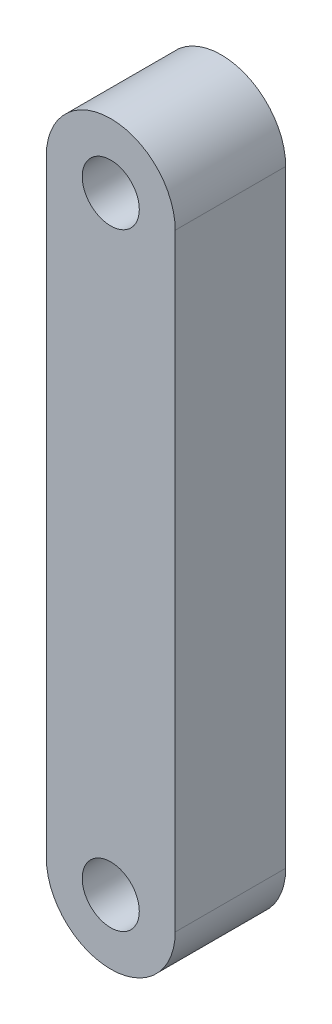
ISO-10303-21;
HEADER;
FILE_DESCRIPTION(('STEP AP214'),'2;1');
FILE_NAME('part.step','',(''),(''),'','','');
FILE_SCHEMA(('AUTOMOTIVE_DESIGN { 1 0 10303 214 1 1 1 1 }'));
ENDSEC;
DATA;
#1=APPLICATION_CONTEXT('core data for automotive mechanical design processes');
#2=APPLICATION_PROTOCOL_DEFINITION('international standard','automotive_design',2000,#1);
#3=PRODUCT_CONTEXT('',#1,'mechanical');
#4=PRODUCT('Part','Part','',(#3));
#5=PRODUCT_RELATED_PRODUCT_CATEGORY('part','',(#4));
#6=PRODUCT_DEFINITION_FORMATION('','',#4);
#7=PRODUCT_DEFINITION_CONTEXT('part definition',#1,'design');
#8=PRODUCT_DEFINITION('design','',#6,#7);
#9=PRODUCT_DEFINITION_SHAPE('','',#8);
#10=(LENGTH_UNIT() NAMED_UNIT(*) SI_UNIT(.MILLI.,.METRE.));
#11=(NAMED_UNIT(*) PLANE_ANGLE_UNIT() SI_UNIT($,.RADIAN.));
#12=(NAMED_UNIT(*) SI_UNIT($,.STERADIAN.) SOLID_ANGLE_UNIT());
#13=UNCERTAINTY_MEASURE_WITH_UNIT(LENGTH_MEASURE(1.E-05),#10,'distance_accuracy_value','');
#14=(GEOMETRIC_REPRESENTATION_CONTEXT(3) GLOBAL_UNCERTAINTY_ASSIGNED_CONTEXT((#13)) GLOBAL_UNIT_ASSIGNED_CONTEXT((#10,
#11,#12)) REPRESENTATION_CONTEXT('',''));
#15=CARTESIAN_POINT('',(0.,0.,0.));
#16=DIRECTION('',(0.,0.,1.));
#17=DIRECTION('',(1.,0.,0.));
#18=AXIS2_PLACEMENT_3D('',#15,#16,#17);
#19=CARTESIAN_POINT('',(1141.44953163294,-4.21114111849392,6.));
#20=DIRECTION('',(0.,0.,1.));
#21=DIRECTION('',(1.,0.,0.));
#22=AXIS2_PLACEMENT_3D('',#19,#20,#21);
#23=PLANE('',#22);
#24=CARTESIAN_POINT('',(1141.44953163294,-4.21114111849392,6.));
#25=DIRECTION('',(0.,0.,1.));
#26=DIRECTION('',(1.,0.,0.));
#27=AXIS2_PLACEMENT_3D('',#24,#25,#26);
#28=CIRCLE('',#27,1.54999999999999);
#29=CARTESIAN_POINT('',(1142.99953163294,-4.21114111849392,6.));
#30=VERTEX_POINT('',#29);
#31=EDGE_CURVE('E101',#30,#30,#28,.T.);
#32=ORIENTED_EDGE('',*,*,#31,.F.);
#33=EDGE_LOOP('',(#32));
#34=FACE_BOUND('',#33,.T.);
#35=CARTESIAN_POINT('',(1141.44953163294,-4.21114111849392,6.));
#36=DIRECTION('',(0.,0.,1.));
#37=DIRECTION('',(1.,0.,0.));
#38=AXIS2_PLACEMENT_3D('',#35,#36,#37);
#39=CIRCLE('',#38,3.50000000000006);
#40=CARTESIAN_POINT('',(1144.94953163294,-4.21114111849392,6.));
#41=VERTEX_POINT('',#40);
#42=CARTESIAN_POINT('',(1137.94953163294,-4.21114111849394,6.));
#43=VERTEX_POINT('',#42);
#44=EDGE_CURVE('E86',#41,#43,#39,.T.);
#45=ORIENTED_EDGE('',*,*,#44,.T.);
#46=DIRECTION('',(0.,-1.,0.));
#47=VECTOR('',#46,1.);
#48=CARTESIAN_POINT('',(1137.94953163294,-4.21114111849394,6.));
#49=LINE('',#48,#47);
#50=CARTESIAN_POINT('',(1137.94953163294,-37.2111411184939,6.));
#51=VERTEX_POINT('',#50);
#52=EDGE_CURVE('E81',#43,#51,#49,.T.);
#53=ORIENTED_EDGE('',*,*,#52,.T.);
#54=CARTESIAN_POINT('',(1141.44953163294,-37.2111411184939,6.));
#55=DIRECTION('',(0.,0.,1.));
#56=DIRECTION('',(1.,0.,0.));
#57=AXIS2_PLACEMENT_3D('',#54,#55,#56);
#58=CIRCLE('',#57,3.50000000000006);
#59=CARTESIAN_POINT('',(1144.94953163294,-37.2111411184939,6.));
#60=VERTEX_POINT('',#59);
#61=EDGE_CURVE('E84',#51,#60,#58,.T.);
#62=ORIENTED_EDGE('',*,*,#61,.T.);
#63=DIRECTION('',(0.,1.,0.));
#64=VECTOR('',#63,1.);
#65=CARTESIAN_POINT('',(1144.94953163294,-37.2111411184939,6.));
#66=LINE('',#65,#64);
#67=EDGE_CURVE('E51',#60,#41,#66,.T.);
#68=ORIENTED_EDGE('',*,*,#67,.T.);
#69=EDGE_LOOP('',(#45,#53,#62,#68));
#70=FACE_BOUND('',#69,.T.);
#71=CARTESIAN_POINT('',(1141.44953163294,-37.2111411184939,6.));
#72=DIRECTION('',(0.,0.,1.));
#73=DIRECTION('',(1.,0.,0.));
#74=AXIS2_PLACEMENT_3D('',#71,#72,#73);
#75=CIRCLE('',#74,1.54999999999999);
#76=CARTESIAN_POINT('',(1142.99953163294,-37.2111411184939,6.));
#77=VERTEX_POINT('',#76);
#78=EDGE_CURVE('E116',#77,#77,#75,.T.);
#79=ORIENTED_EDGE('',*,*,#78,.F.);
#80=EDGE_LOOP('',(#79));
#81=FACE_BOUND('',#80,.T.);
#82=ADVANCED_FACE('F34',(#34,#70,#81),#23,.T.);
#83=CARTESIAN_POINT('',(1141.44953163294,-4.21114111849392,0.));
#84=DIRECTION('',(0.,0.,1.));
#85=DIRECTION('',(1.,0.,0.));
#86=AXIS2_PLACEMENT_3D('',#83,#84,#85);
#87=PLANE('',#86);
#88=CARTESIAN_POINT('',(1141.44953163294,-4.21114111849392,0.));
#89=DIRECTION('',(0.,0.,1.));
#90=DIRECTION('',(1.,0.,0.));
#91=AXIS2_PLACEMENT_3D('',#88,#89,#90);
#92=CIRCLE('',#91,1.54999999999999);
#93=CARTESIAN_POINT('',(1142.99953163294,-4.21114111849392,0.));
#94=VERTEX_POINT('',#93);
#95=EDGE_CURVE('E113',#94,#94,#92,.T.);
#96=ORIENTED_EDGE('',*,*,#95,.T.);
#97=EDGE_LOOP('',(#96));
#98=FACE_BOUND('',#97,.T.);
#99=CARTESIAN_POINT('',(1141.44953163294,-4.21114111849392,0.));
#100=DIRECTION('',(0.,0.,1.));
#101=DIRECTION('',(1.,0.,0.));
#102=AXIS2_PLACEMENT_3D('',#99,#100,#101);
#103=CIRCLE('',#102,3.50000000000006);
#104=CARTESIAN_POINT('',(1144.94953163294,-4.21114111849392,0.));
#105=VERTEX_POINT('',#104);
#106=CARTESIAN_POINT('',(1137.94953163294,-4.21114111849394,0.));
#107=VERTEX_POINT('',#106);
#108=EDGE_CURVE('E98',#105,#107,#103,.T.);
#109=ORIENTED_EDGE('',*,*,#108,.F.);
#110=DIRECTION('',(0.,1.,0.));
#111=VECTOR('',#110,1.);
#112=CARTESIAN_POINT('',(1144.94953163294,-37.2111411184939,0.));
#113=LINE('',#112,#111);
#114=CARTESIAN_POINT('',(1144.94953163294,-37.2111411184939,0.));
#115=VERTEX_POINT('',#114);
#116=EDGE_CURVE('E74',#115,#105,#113,.T.);
#117=ORIENTED_EDGE('',*,*,#116,.F.);
#118=CARTESIAN_POINT('',(1141.44953163294,-37.2111411184939,0.));
#119=DIRECTION('',(0.,0.,1.));
#120=DIRECTION('',(1.,0.,0.));
#121=AXIS2_PLACEMENT_3D('',#118,#119,#120);
#122=CIRCLE('',#121,3.50000000000006);
#123=CARTESIAN_POINT('',(1137.94953163294,-37.2111411184939,0.));
#124=VERTEX_POINT('',#123);
#125=EDGE_CURVE('E68',#124,#115,#122,.T.);
#126=ORIENTED_EDGE('',*,*,#125,.F.);
#127=DIRECTION('',(0.,-1.,0.));
#128=VECTOR('',#127,1.);
#129=CARTESIAN_POINT('',(1137.94953163294,-4.21114111849394,0.));
#130=LINE('',#129,#128);
#131=EDGE_CURVE('E90',#107,#124,#130,.T.);
#132=ORIENTED_EDGE('',*,*,#131,.F.);
#133=EDGE_LOOP('',(#109,#117,#126,#132));
#134=FACE_BOUND('',#133,.T.);
#135=CARTESIAN_POINT('',(1141.44953163294,-37.2111411184939,0.));
#136=DIRECTION('',(0.,0.,1.));
#137=DIRECTION('',(1.,0.,0.));
#138=AXIS2_PLACEMENT_3D('',#135,#136,#137);
#139=CIRCLE('',#138,1.54999999999999);
#140=CARTESIAN_POINT('',(1142.99953163294,-37.2111411184939,0.));
#141=VERTEX_POINT('',#140);
#142=EDGE_CURVE('E119',#141,#141,#139,.T.);
#143=ORIENTED_EDGE('',*,*,#142,.T.);
#144=EDGE_LOOP('',(#143));
#145=FACE_BOUND('',#144,.T.);
#146=ADVANCED_FACE('F109',(#98,#134,#145),#87,.F.);
#147=CARTESIAN_POINT('',(1141.44953163294,-4.21114111849392,6.));
#148=DIRECTION('',(0.,0.,-1.));
#149=DIRECTION('',(-1.,0.,0.));
#150=AXIS2_PLACEMENT_3D('',#147,#148,#149);
#151=CYLINDRICAL_SURFACE('',#150,3.50000000000006);
#152=ORIENTED_EDGE('',*,*,#108,.T.);
#153=DIRECTION('',(0.,0.,-1.));
#154=VECTOR('',#153,1.);
#155=CARTESIAN_POINT('',(1137.94953163294,-4.21114111849394,6.));
#156=LINE('',#155,#154);
#157=EDGE_CURVE('E11',#43,#107,#156,.T.);
#158=ORIENTED_EDGE('',*,*,#157,.F.);
#159=ORIENTED_EDGE('',*,*,#44,.F.);
#160=DIRECTION('',(0.,0.,-1.));
#161=VECTOR('',#160,1.);
#162=CARTESIAN_POINT('',(1144.94953163294,-4.21114111849392,6.));
#163=LINE('',#162,#161);
#164=EDGE_CURVE('E94',#41,#105,#163,.T.);
#165=ORIENTED_EDGE('',*,*,#164,.T.);
#166=EDGE_LOOP('',(#152,#158,#159,#165));
#167=FACE_BOUND('',#166,.T.);
#168=ADVANCED_FACE('F36',(#167),#151,.T.);
#169=CARTESIAN_POINT('',(1137.94953163294,-4.21114111849394,6.));
#170=DIRECTION('',(1.,0.,0.));
#171=DIRECTION('',(0.,0.,-1.));
#172=AXIS2_PLACEMENT_3D('',#169,#170,#171);
#173=PLANE('',#172);
#174=ORIENTED_EDGE('',*,*,#131,.T.);
#175=DIRECTION('',(0.,0.,-1.));
#176=VECTOR('',#175,1.);
#177=CARTESIAN_POINT('',(1137.94953163294,-37.2111411184939,6.));
#178=LINE('',#177,#176);
#179=EDGE_CURVE('E43',#51,#124,#178,.T.);
#180=ORIENTED_EDGE('',*,*,#179,.F.);
#181=ORIENTED_EDGE('',*,*,#52,.F.);
#182=ORIENTED_EDGE('',*,*,#157,.T.);
#183=EDGE_LOOP('',(#174,#180,#181,#182));
#184=FACE_BOUND('',#183,.T.);
#185=ADVANCED_FACE('F89',(#184),#173,.F.);
#186=CARTESIAN_POINT('',(1141.44953163294,-37.2111411184939,6.));
#187=DIRECTION('',(0.,0.,-1.));
#188=DIRECTION('',(-1.,0.,0.));
#189=AXIS2_PLACEMENT_3D('',#186,#187,#188);
#190=CYLINDRICAL_SURFACE('',#189,3.50000000000006);
#191=ORIENTED_EDGE('',*,*,#125,.T.);
#192=DIRECTION('',(0.,0.,-1.));
#193=VECTOR('',#192,1.);
#194=CARTESIAN_POINT('',(1144.94953163294,-37.2111411184939,6.));
#195=LINE('',#194,#193);
#196=EDGE_CURVE('E91',#60,#115,#195,.T.);
#197=ORIENTED_EDGE('',*,*,#196,.F.);
#198=ORIENTED_EDGE('',*,*,#61,.F.);
#199=ORIENTED_EDGE('',*,*,#179,.T.);
#200=EDGE_LOOP('',(#191,#197,#198,#199));
#201=FACE_BOUND('',#200,.T.);
#202=ADVANCED_FACE('F92',(#201),#190,.T.);
#203=CARTESIAN_POINT('',(1144.94953163294,-37.2111411184939,6.));
#204=DIRECTION('',(-1.,0.,0.));
#205=DIRECTION('',(0.,0.,1.));
#206=AXIS2_PLACEMENT_3D('',#203,#204,#205);
#207=PLANE('',#206);
#208=ORIENTED_EDGE('',*,*,#116,.T.);
#209=ORIENTED_EDGE('',*,*,#164,.F.);
#210=ORIENTED_EDGE('',*,*,#67,.F.);
#211=ORIENTED_EDGE('',*,*,#196,.T.);
#212=EDGE_LOOP('',(#208,#209,#210,#211));
#213=FACE_BOUND('',#212,.T.);
#214=ADVANCED_FACE('F106',(#213),#207,.F.);
#215=CARTESIAN_POINT('',(1141.44953163294,-4.21114111849392,6.));
#216=DIRECTION('',(0.,0.,-1.));
#217=DIRECTION('',(-1.,0.,0.));
#218=AXIS2_PLACEMENT_3D('',#215,#216,#217);
#219=CYLINDRICAL_SURFACE('',#218,1.54999999999999);
#220=ORIENTED_EDGE('',*,*,#31,.T.);
#221=EDGE_LOOP('',(#220));
#222=FACE_BOUND('',#221,.T.);
#223=ORIENTED_EDGE('',*,*,#95,.F.);
#224=EDGE_LOOP('',(#223));
#225=FACE_BOUND('',#224,.T.);
#226=ADVANCED_FACE('F137',(#222,#225),#219,.F.);
#227=CARTESIAN_POINT('',(1141.44953163294,-37.2111411184939,6.));
#228=DIRECTION('',(0.,0.,-1.));
#229=DIRECTION('',(-1.,0.,0.));
#230=AXIS2_PLACEMENT_3D('',#227,#228,#229);
#231=CYLINDRICAL_SURFACE('',#230,1.54999999999999);
#232=ORIENTED_EDGE('',*,*,#78,.T.);
#233=EDGE_LOOP('',(#232));
#234=FACE_BOUND('',#233,.T.);
#235=ORIENTED_EDGE('',*,*,#142,.F.);
#236=EDGE_LOOP('',(#235));
#237=FACE_BOUND('',#236,.T.);
#238=ADVANCED_FACE('F125',(#234,#237),#231,.F.);
#239=CLOSED_SHELL('',(#82,#146,#168,#185,#202,#214,#226,#238));
#240=MANIFOLD_SOLID_BREP('B2',#239);
#241=ADVANCED_BREP_SHAPE_REPRESENTATION('',(#18,#240),#14);
#242=SHAPE_DEFINITION_REPRESENTATION(#9,#241);
ENDSEC;
END-ISO-10303-21;
